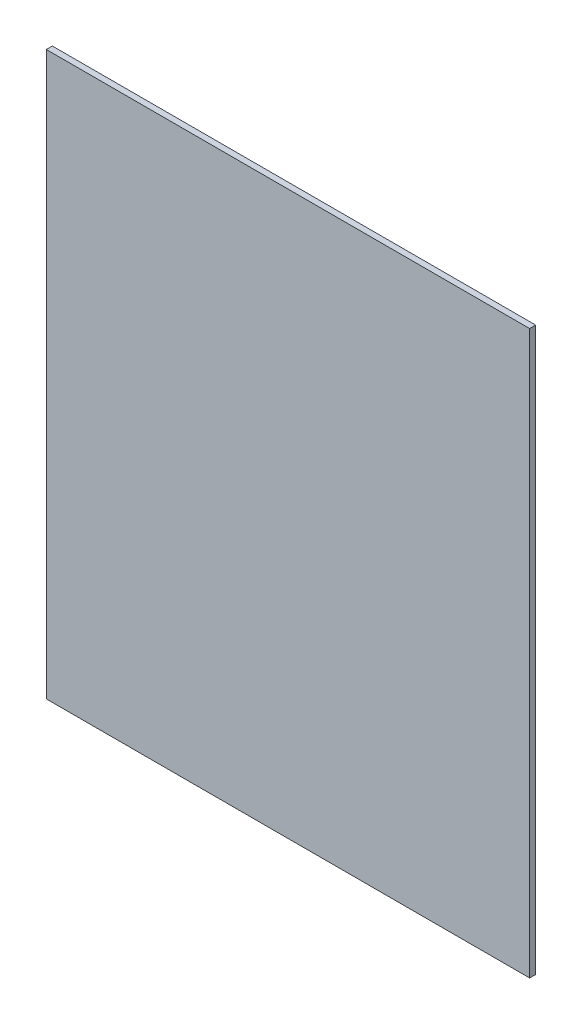
ISO-10303-21;
HEADER;
FILE_DESCRIPTION(('STEP AP214'),'2;1');
FILE_NAME('part.step','',(''),(''),'','','');
FILE_SCHEMA(('AUTOMOTIVE_DESIGN { 1 0 10303 214 1 1 1 1 }'));
ENDSEC;
DATA;
#1=APPLICATION_CONTEXT('core data for automotive mechanical design processes');
#2=APPLICATION_PROTOCOL_DEFINITION('international standard','automotive_design',2000,#1);
#3=PRODUCT_CONTEXT('',#1,'mechanical');
#4=PRODUCT('Part','Part','',(#3));
#5=PRODUCT_RELATED_PRODUCT_CATEGORY('part','',(#4));
#6=PRODUCT_DEFINITION_FORMATION('','',#4);
#7=PRODUCT_DEFINITION_CONTEXT('part definition',#1,'design');
#8=PRODUCT_DEFINITION('design','',#6,#7);
#9=PRODUCT_DEFINITION_SHAPE('','',#8);
#10=(LENGTH_UNIT() NAMED_UNIT(*) SI_UNIT(.MILLI.,.METRE.));
#11=(NAMED_UNIT(*) PLANE_ANGLE_UNIT() SI_UNIT($,.RADIAN.));
#12=(NAMED_UNIT(*) SI_UNIT($,.STERADIAN.) SOLID_ANGLE_UNIT());
#13=UNCERTAINTY_MEASURE_WITH_UNIT(LENGTH_MEASURE(1.E-05),#10,'distance_accuracy_value','');
#14=(GEOMETRIC_REPRESENTATION_CONTEXT(3) GLOBAL_UNCERTAINTY_ASSIGNED_CONTEXT((#13)) GLOBAL_UNIT_ASSIGNED_CONTEXT((#10,
#11,#12)) REPRESENTATION_CONTEXT('',''));
#15=CARTESIAN_POINT('',(0.,0.,0.));
#16=DIRECTION('',(0.,0.,1.));
#17=DIRECTION('',(1.,0.,0.));
#18=AXIS2_PLACEMENT_3D('',#15,#16,#17);
#19=CARTESIAN_POINT('',(-63.5,73.8886,1.5875));
#20=DIRECTION('',(1.,0.,0.));
#21=DIRECTION('',(0.,1.,0.));
#22=AXIS2_PLACEMENT_3D('',#19,#20,#21);
#23=PLANE('',#22);
#24=DIRECTION('',(0.,-1.,0.));
#25=VECTOR('',#24,1.);
#26=CARTESIAN_POINT('',(-63.5,73.8886,0.));
#27=LINE('',#26,#25);
#28=CARTESIAN_POINT('',(-63.5,73.8886,0.));
#29=VERTEX_POINT('',#28);
#30=CARTESIAN_POINT('',(-63.5,-73.8886,0.));
#31=VERTEX_POINT('',#30);
#32=EDGE_CURVE('E107',#29,#31,#27,.T.);
#33=ORIENTED_EDGE('',*,*,#32,.T.);
#34=DIRECTION('',(0.,0.,-1.));
#35=VECTOR('',#34,1.);
#36=CARTESIAN_POINT('',(-63.5,-73.8886,1.5875));
#37=LINE('',#36,#35);
#38=CARTESIAN_POINT('',(-63.5,-73.8886,1.5875));
#39=VERTEX_POINT('',#38);
#40=EDGE_CURVE('E11',#39,#31,#37,.T.);
#41=ORIENTED_EDGE('',*,*,#40,.F.);
#42=DIRECTION('',(0.,-1.,0.));
#43=VECTOR('',#42,1.);
#44=CARTESIAN_POINT('',(-63.5,73.8886,1.5875));
#45=LINE('',#44,#43);
#46=CARTESIAN_POINT('',(-63.5,73.8886,1.5875));
#47=VERTEX_POINT('',#46);
#48=EDGE_CURVE('E91',#47,#39,#45,.T.);
#49=ORIENTED_EDGE('',*,*,#48,.F.);
#50=DIRECTION('',(0.,0.,-1.));
#51=VECTOR('',#50,1.);
#52=CARTESIAN_POINT('',(-63.5,73.8886,1.5875));
#53=LINE('',#52,#51);
#54=EDGE_CURVE('E103',#47,#29,#53,.T.);
#55=ORIENTED_EDGE('',*,*,#54,.T.);
#56=EDGE_LOOP('',(#33,#41,#49,#55));
#57=FACE_BOUND('',#56,.T.);
#58=ADVANCED_FACE('F39',(#57),#23,.F.);
#59=CARTESIAN_POINT('',(63.5,-73.8886,1.5875));
#60=DIRECTION('',(0.,1.,0.));
#61=DIRECTION('',(-1.,0.,0.));
#62=AXIS2_PLACEMENT_3D('',#59,#60,#61);
#63=PLANE('',#62);
#64=DIRECTION('',(1.,0.,0.));
#65=VECTOR('',#64,1.);
#66=CARTESIAN_POINT('',(63.5,-73.8886,0.));
#67=LINE('',#66,#65);
#68=CARTESIAN_POINT('',(63.5,-73.8886,0.));
#69=VERTEX_POINT('',#68);
#70=EDGE_CURVE('E96',#31,#69,#67,.T.);
#71=ORIENTED_EDGE('',*,*,#70,.T.);
#72=DIRECTION('',(0.,0.,-1.));
#73=VECTOR('',#72,1.);
#74=CARTESIAN_POINT('',(63.5,-73.8886,1.5875));
#75=LINE('',#74,#73);
#76=CARTESIAN_POINT('',(63.5,-73.8886,1.5875));
#77=VERTEX_POINT('',#76);
#78=EDGE_CURVE('E48',#77,#69,#75,.T.);
#79=ORIENTED_EDGE('',*,*,#78,.F.);
#80=DIRECTION('',(1.,0.,0.));
#81=VECTOR('',#80,1.);
#82=CARTESIAN_POINT('',(63.5,-73.8886,1.5875));
#83=LINE('',#82,#81);
#84=EDGE_CURVE('E86',#39,#77,#83,.T.);
#85=ORIENTED_EDGE('',*,*,#84,.F.);
#86=ORIENTED_EDGE('',*,*,#40,.T.);
#87=EDGE_LOOP('',(#71,#79,#85,#86));
#88=FACE_BOUND('',#87,.T.);
#89=ADVANCED_FACE('F95',(#88),#63,.F.);
#90=CARTESIAN_POINT('',(63.5,73.8886,1.5875));
#91=DIRECTION('',(-1.,0.,0.));
#92=DIRECTION('',(0.,-1.,0.));
#93=AXIS2_PLACEMENT_3D('',#90,#91,#92);
#94=PLANE('',#93);
#95=DIRECTION('',(0.,1.,0.));
#96=VECTOR('',#95,1.);
#97=CARTESIAN_POINT('',(63.5,73.8886,0.));
#98=LINE('',#97,#96);
#99=CARTESIAN_POINT('',(63.5,73.8886,0.));
#100=VERTEX_POINT('',#99);
#101=EDGE_CURVE('E73',#69,#100,#98,.T.);
#102=ORIENTED_EDGE('',*,*,#101,.T.);
#103=DIRECTION('',(0.,0.,-1.));
#104=VECTOR('',#103,1.);
#105=CARTESIAN_POINT('',(63.5,73.8886,1.5875));
#106=LINE('',#105,#104);
#107=CARTESIAN_POINT('',(63.5,73.8886,1.5875));
#108=VERTEX_POINT('',#107);
#109=EDGE_CURVE('E98',#108,#100,#106,.T.);
#110=ORIENTED_EDGE('',*,*,#109,.F.);
#111=DIRECTION('',(0.,1.,0.));
#112=VECTOR('',#111,1.);
#113=CARTESIAN_POINT('',(63.5,73.8886,1.5875));
#114=LINE('',#113,#112);
#115=EDGE_CURVE('E89',#77,#108,#114,.T.);
#116=ORIENTED_EDGE('',*,*,#115,.F.);
#117=ORIENTED_EDGE('',*,*,#78,.T.);
#118=EDGE_LOOP('',(#102,#110,#116,#117));
#119=FACE_BOUND('',#118,.T.);
#120=ADVANCED_FACE('F99',(#119),#94,.F.);
#121=CARTESIAN_POINT('',(63.5,73.8886,1.5875));
#122=DIRECTION('',(0.,-1.,0.));
#123=DIRECTION('',(1.,0.,0.));
#124=AXIS2_PLACEMENT_3D('',#121,#122,#123);
#125=PLANE('',#124);
#126=DIRECTION('',(-1.,0.,0.));
#127=VECTOR('',#126,1.);
#128=CARTESIAN_POINT('',(63.5,73.8886,0.));
#129=LINE('',#128,#127);
#130=EDGE_CURVE('E79',#100,#29,#129,.T.);
#131=ORIENTED_EDGE('',*,*,#130,.T.);
#132=ORIENTED_EDGE('',*,*,#54,.F.);
#133=DIRECTION('',(-1.,0.,0.));
#134=VECTOR('',#133,1.);
#135=CARTESIAN_POINT('',(63.5,73.8886,1.5875));
#136=LINE('',#135,#134);
#137=EDGE_CURVE('E56',#108,#47,#136,.T.);
#138=ORIENTED_EDGE('',*,*,#137,.F.);
#139=ORIENTED_EDGE('',*,*,#109,.T.);
#140=EDGE_LOOP('',(#131,#132,#138,#139));
#141=FACE_BOUND('',#140,.T.);
#142=ADVANCED_FACE('F120',(#141),#125,.F.);
#143=CARTESIAN_POINT('',(0.,0.,1.5875));
#144=DIRECTION('',(0.,0.,-1.));
#145=DIRECTION('',(-1.,0.,0.));
#146=AXIS2_PLACEMENT_3D('',#143,#144,#145);
#147=PLANE('',#146);
#148=ORIENTED_EDGE('',*,*,#48,.T.);
#149=ORIENTED_EDGE('',*,*,#84,.T.);
#150=ORIENTED_EDGE('',*,*,#115,.T.);
#151=ORIENTED_EDGE('',*,*,#137,.T.);
#152=EDGE_LOOP('',(#148,#149,#150,#151));
#153=FACE_BOUND('',#152,.T.);
#154=ADVANCED_FACE('F87',(#153),#147,.F.);
#155=CARTESIAN_POINT('',(0.,0.,0.));
#156=DIRECTION('',(0.,0.,-1.));
#157=DIRECTION('',(-1.,0.,0.));
#158=AXIS2_PLACEMENT_3D('',#155,#156,#157);
#159=PLANE('',#158);
#160=ORIENTED_EDGE('',*,*,#32,.F.);
#161=ORIENTED_EDGE('',*,*,#130,.F.);
#162=ORIENTED_EDGE('',*,*,#101,.F.);
#163=ORIENTED_EDGE('',*,*,#70,.F.);
#164=EDGE_LOOP('',(#160,#161,#162,#163));
#165=FACE_BOUND('',#164,.T.);
#166=ADVANCED_FACE('F123',(#165),#159,.T.);
#167=CLOSED_SHELL('',(#58,#89,#120,#142,#154,#166));
#168=MANIFOLD_SOLID_BREP('B2',#167);
#169=ADVANCED_BREP_SHAPE_REPRESENTATION('',(#18,#168),#14);
#170=SHAPE_DEFINITION_REPRESENTATION(#9,#169);
ENDSEC;
END-ISO-10303-21;
